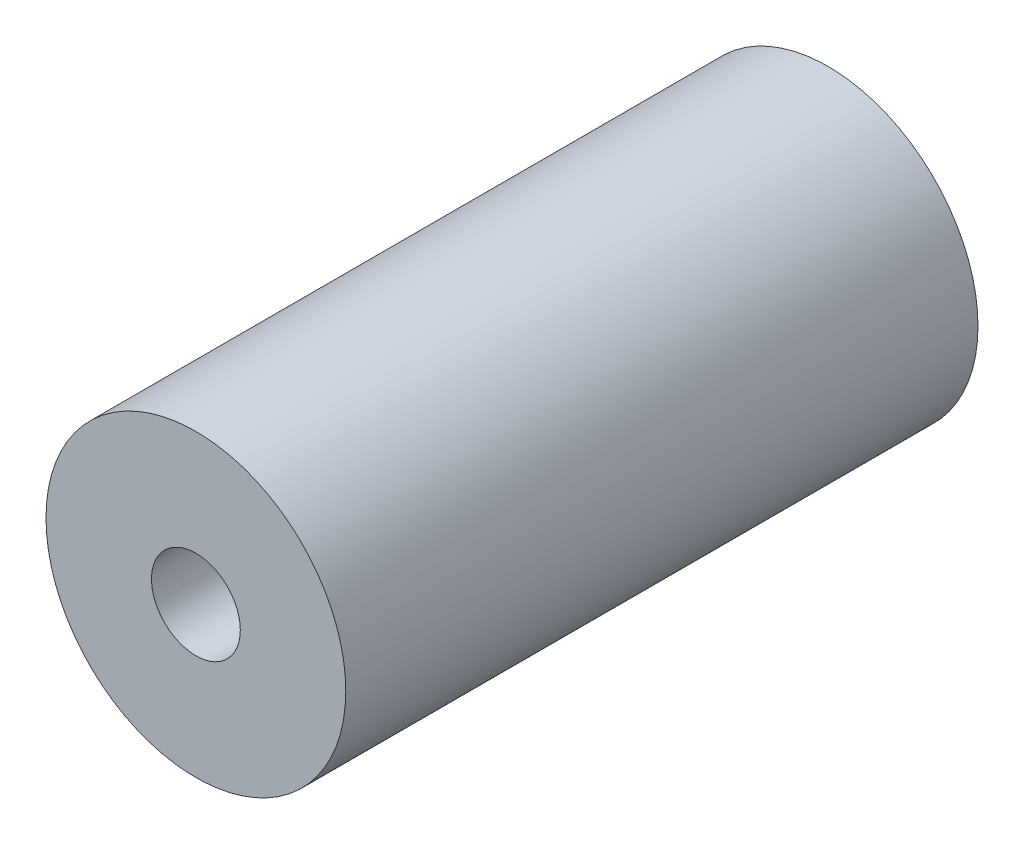
ISO-10303-21;
HEADER;
FILE_DESCRIPTION(('STEP AP214'),'2;1');
FILE_NAME('part.step','',(''),(''),'','','');
FILE_SCHEMA(('AUTOMOTIVE_DESIGN { 1 0 10303 214 1 1 1 1 }'));
ENDSEC;
DATA;
#1=APPLICATION_CONTEXT('core data for automotive mechanical design processes');
#2=APPLICATION_PROTOCOL_DEFINITION('international standard','automotive_design',2000,#1);
#3=PRODUCT_CONTEXT('',#1,'mechanical');
#4=PRODUCT('Part','Part','',(#3));
#5=PRODUCT_RELATED_PRODUCT_CATEGORY('part','',(#4));
#6=PRODUCT_DEFINITION_FORMATION('','',#4);
#7=PRODUCT_DEFINITION_CONTEXT('part definition',#1,'design');
#8=PRODUCT_DEFINITION('design','',#6,#7);
#9=PRODUCT_DEFINITION_SHAPE('','',#8);
#10=(LENGTH_UNIT() NAMED_UNIT(*) SI_UNIT(.MILLI.,.METRE.));
#11=(NAMED_UNIT(*) PLANE_ANGLE_UNIT() SI_UNIT($,.RADIAN.));
#12=(NAMED_UNIT(*) SI_UNIT($,.STERADIAN.) SOLID_ANGLE_UNIT());
#13=UNCERTAINTY_MEASURE_WITH_UNIT(LENGTH_MEASURE(1.E-05),#10,'distance_accuracy_value','');
#14=(GEOMETRIC_REPRESENTATION_CONTEXT(3) GLOBAL_UNCERTAINTY_ASSIGNED_CONTEXT((#13)) GLOBAL_UNIT_ASSIGNED_CONTEXT((#10,
#11,#12)) REPRESENTATION_CONTEXT('',''));
#15=CARTESIAN_POINT('',(0.,0.,0.));
#16=DIRECTION('',(0.,0.,1.));
#17=DIRECTION('',(1.,0.,0.));
#18=AXIS2_PLACEMENT_3D('',#15,#16,#17);
#19=CARTESIAN_POINT('',(0.,0.,135.6));
#20=DIRECTION('',(0.,0.,1.));
#21=DIRECTION('',(1.,0.,0.));
#22=AXIS2_PLACEMENT_3D('',#19,#20,#21);
#23=PLANE('',#22);
#24=CARTESIAN_POINT('',(0.,0.,135.6));
#25=DIRECTION('',(0.,0.,1.));
#26=DIRECTION('',(1.,0.,0.));
#27=AXIS2_PLACEMENT_3D('',#24,#25,#26);
#28=CIRCLE('',#27,32.15);
#29=CARTESIAN_POINT('',(32.15,0.,135.6));
#30=VERTEX_POINT('',#29);
#31=EDGE_CURVE('E10',#30,#30,#28,.T.);
#32=ORIENTED_EDGE('',*,*,#31,.T.);
#33=EDGE_LOOP('',(#32));
#34=FACE_BOUND('',#33,.T.);
#35=CARTESIAN_POINT('',(0.,0.,135.6));
#36=DIRECTION('',(0.,0.,1.));
#37=DIRECTION('',(1.,0.,0.));
#38=AXIS2_PLACEMENT_3D('',#35,#36,#37);
#39=CIRCLE('',#38,9.525);
#40=CARTESIAN_POINT('',(9.525,0.,135.6));
#41=VERTEX_POINT('',#40);
#42=EDGE_CURVE('E55',#41,#41,#39,.T.);
#43=ORIENTED_EDGE('',*,*,#42,.F.);
#44=EDGE_LOOP('',(#43));
#45=FACE_BOUND('',#44,.T.);
#46=ADVANCED_FACE('F42',(#34,#45),#23,.T.);
#47=CARTESIAN_POINT('',(0.,0.,0.));
#48=DIRECTION('',(0.,0.,1.));
#49=DIRECTION('',(1.,0.,0.));
#50=AXIS2_PLACEMENT_3D('',#47,#48,#49);
#51=PLANE('',#50);
#52=CARTESIAN_POINT('',(0.,0.,0.));
#53=DIRECTION('',(0.,0.,1.));
#54=DIRECTION('',(1.,0.,0.));
#55=AXIS2_PLACEMENT_3D('',#52,#53,#54);
#56=CIRCLE('',#55,32.15);
#57=CARTESIAN_POINT('',(32.15,0.,0.));
#58=VERTEX_POINT('',#57);
#59=EDGE_CURVE('E46',#58,#58,#56,.T.);
#60=ORIENTED_EDGE('',*,*,#59,.F.);
#61=EDGE_LOOP('',(#60));
#62=FACE_BOUND('',#61,.T.);
#63=CARTESIAN_POINT('',(0.,0.,0.));
#64=DIRECTION('',(0.,0.,1.));
#65=DIRECTION('',(1.,0.,0.));
#66=AXIS2_PLACEMENT_3D('',#63,#64,#65);
#67=CIRCLE('',#66,9.525);
#68=CARTESIAN_POINT('',(9.525,0.,0.));
#69=VERTEX_POINT('',#68);
#70=EDGE_CURVE('E57',#69,#69,#67,.T.);
#71=ORIENTED_EDGE('',*,*,#70,.T.);
#72=EDGE_LOOP('',(#71));
#73=FACE_BOUND('',#72,.T.);
#74=ADVANCED_FACE('F69',(#62,#73),#51,.F.);
#75=CARTESIAN_POINT('',(0.,0.,135.6));
#76=DIRECTION('',(0.,0.,-1.));
#77=DIRECTION('',(-1.,0.,0.));
#78=AXIS2_PLACEMENT_3D('',#75,#76,#77);
#79=CYLINDRICAL_SURFACE('',#78,32.15);
#80=ORIENTED_EDGE('',*,*,#31,.F.);
#81=EDGE_LOOP('',(#80));
#82=FACE_BOUND('',#81,.T.);
#83=ORIENTED_EDGE('',*,*,#59,.T.);
#84=EDGE_LOOP('',(#83));
#85=FACE_BOUND('',#84,.T.);
#86=ADVANCED_FACE('F44',(#82,#85),#79,.T.);
#87=CARTESIAN_POINT('',(0.,0.,135.6));
#88=DIRECTION('',(0.,0.,-1.));
#89=DIRECTION('',(-1.,0.,0.));
#90=AXIS2_PLACEMENT_3D('',#87,#88,#89);
#91=CYLINDRICAL_SURFACE('',#90,9.525);
#92=ORIENTED_EDGE('',*,*,#42,.T.);
#93=EDGE_LOOP('',(#92));
#94=FACE_BOUND('',#93,.T.);
#95=ORIENTED_EDGE('',*,*,#70,.F.);
#96=EDGE_LOOP('',(#95));
#97=FACE_BOUND('',#96,.T.);
#98=ADVANCED_FACE('F65',(#94,#97),#91,.F.);
#99=CLOSED_SHELL('',(#46,#74,#86,#98));
#100=MANIFOLD_SOLID_BREP('B2',#99);
#101=ADVANCED_BREP_SHAPE_REPRESENTATION('',(#18,#100),#14);
#102=SHAPE_DEFINITION_REPRESENTATION(#9,#101);
ENDSEC;
END-ISO-10303-21;
